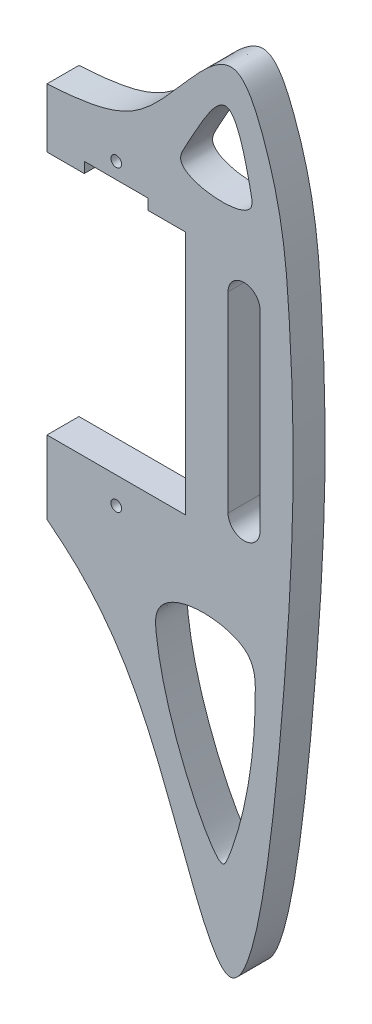
ISO-10303-21;
HEADER;
FILE_DESCRIPTION(('STEP AP214'),'2;1');
FILE_NAME('part.step','',(''),(''),'','','');
FILE_SCHEMA(('AUTOMOTIVE_DESIGN { 1 0 10303 214 1 1 1 1 }'));
ENDSEC;
DATA;
#1=APPLICATION_CONTEXT('core data for automotive mechanical design processes');
#2=APPLICATION_PROTOCOL_DEFINITION('international standard','automotive_design',2000,#1);
#3=PRODUCT_CONTEXT('',#1,'mechanical');
#4=PRODUCT('Part','Part','',(#3));
#5=PRODUCT_RELATED_PRODUCT_CATEGORY('part','',(#4));
#6=PRODUCT_DEFINITION_FORMATION('','',#4);
#7=PRODUCT_DEFINITION_CONTEXT('part definition',#1,'design');
#8=PRODUCT_DEFINITION('design','',#6,#7);
#9=PRODUCT_DEFINITION_SHAPE('','',#8);
#10=(LENGTH_UNIT() NAMED_UNIT(*) SI_UNIT(.MILLI.,.METRE.));
#11=(NAMED_UNIT(*) PLANE_ANGLE_UNIT() SI_UNIT($,.RADIAN.));
#12=(NAMED_UNIT(*) SI_UNIT($,.STERADIAN.) SOLID_ANGLE_UNIT());
#13=UNCERTAINTY_MEASURE_WITH_UNIT(LENGTH_MEASURE(1.E-05),#10,'distance_accuracy_value','');
#14=(GEOMETRIC_REPRESENTATION_CONTEXT(3) GLOBAL_UNCERTAINTY_ASSIGNED_CONTEXT((#13)) GLOBAL_UNIT_ASSIGNED_CONTEXT((#10,
#11,#12)) REPRESENTATION_CONTEXT('',''));
#15=CARTESIAN_POINT('',(0.,0.,0.));
#16=DIRECTION('',(0.,0.,1.));
#17=DIRECTION('',(1.,0.,0.));
#18=AXIS2_PLACEMENT_3D('',#15,#16,#17);
#19=CARTESIAN_POINT('',(-6.5,24.5905263107567,3.));
#20=DIRECTION('',(0.,-1.,0.));
#21=DIRECTION('',(0.,0.,-1.));
#22=AXIS2_PLACEMENT_3D('',#19,#20,#21);
#23=PLANE('',#22);
#24=DIRECTION('',(0.,0.,-1.));
#25=VECTOR('',#24,1.);
#26=CARTESIAN_POINT('',(3.00000000000001,24.5905263107567,-0.0015000000000002));
#27=LINE('',#26,#25);
#28=CARTESIAN_POINT('',(3.00000000000001,24.5905263107567,3.));
#29=VERTEX_POINT('',#28);
#30=CARTESIAN_POINT('',(3.00000000000001,24.5905263107567,0.));
#31=VERTEX_POINT('',#30);
#32=EDGE_CURVE('E239',#29,#31,#27,.T.);
#33=ORIENTED_EDGE('',*,*,#32,.T.);
#34=DIRECTION('',(-1.,0.,0.));
#35=VECTOR('',#34,1.);
#36=CARTESIAN_POINT('',(-6.5,24.5905263107567,0.));
#37=LINE('',#36,#35);
#38=CARTESIAN_POINT('',(6.5,24.5905263107567,0.));
#39=VERTEX_POINT('',#38);
#40=EDGE_CURVE('E242',#39,#31,#37,.T.);
#41=ORIENTED_EDGE('',*,*,#40,.F.);
#42=DIRECTION('',(0.,0.,-1.));
#43=VECTOR('',#42,1.);
#44=CARTESIAN_POINT('',(6.5,24.5905263107567,3.));
#45=LINE('',#44,#43);
#46=CARTESIAN_POINT('',(6.5,24.5905263107567,3.));
#47=VERTEX_POINT('',#46);
#48=EDGE_CURVE('E271',#47,#39,#45,.T.);
#49=ORIENTED_EDGE('',*,*,#48,.F.);
#50=DIRECTION('',(-1.,0.,0.));
#51=VECTOR('',#50,1.);
#52=CARTESIAN_POINT('',(-6.5,24.5905263107567,3.));
#53=LINE('',#52,#51);
#54=EDGE_CURVE('E245',#47,#29,#53,.T.);
#55=ORIENTED_EDGE('',*,*,#54,.T.);
#56=EDGE_LOOP('',(#33,#41,#49,#55));
#57=FACE_BOUND('',#56,.T.);
#58=ADVANCED_FACE('F33',(#57),#23,.T.);
#59=CARTESIAN_POINT('',(16.144596176441,-2.45539061688267,3.));
#60=DIRECTION('',(0.,0.,-1.));
#61=DIRECTION('',(-1.,0.,0.));
#62=AXIS2_PLACEMENT_3D('',#59,#60,#61);
#63=PLANE('',#62);
#64=CARTESIAN_POINT('',(10.372881689873,36.6963033627782,3.));
#65=CARTESIAN_POINT('',(9.31519500281639,36.9421991387234,3.));
#66=CARTESIAN_POINT('',(7.64063538034041,33.5239718010335,3.));
#67=CARTESIAN_POINT('',(4.87372732580464,28.7722586727291,3.));
#68=CARTESIAN_POINT('',(13.220521781435,28.0731721959154,3.));
#69=CARTESIAN_POINT('',(12.2719699943296,32.6964527488286,3.));
#70=CARTESIAN_POINT('',(11.393815380506,36.4589520893633,3.));
#71=CARTESIAN_POINT('',(10.372881689873,36.6963033627782,3.));
#72=B_SPLINE_CURVE_WITH_KNOTS('',3,(#64,#65,#66,#67,#68,#69,#70,#71),.UNSPECIFIED.,.T.,.F.,(4,1,
1,1,1,4),(0.,0.311317763255228,0.3779288802976,0.634090915965268,0.699500053381354,1.),.UNSPECIFIED.);
#73=CARTESIAN_POINT('',(10.372881689873,36.6963033627782,3.));
#74=VERTEX_POINT('',#73);
#75=EDGE_CURVE('E391',#74,#74,#72,.T.);
#76=ORIENTED_EDGE('',*,*,#75,.F.);
#77=EDGE_LOOP('',(#76));
#78=FACE_BOUND('',#77,.T.);
#79=DIRECTION('',(0.,-1.,0.));
#80=VECTOR('',#79,1.);
#81=CARTESIAN_POINT('',(10.5,21.7388183196672,3.));
#82=LINE('',#81,#80);
#83=CARTESIAN_POINT('',(10.5,21.7388183196672,3.));
#84=VERTEX_POINT('',#83);
#85=CARTESIAN_POINT('',(10.5,3.73881831966721,3.));
#86=VERTEX_POINT('',#85);
#87=EDGE_CURVE('E149',#84,#86,#82,.T.);
#88=ORIENTED_EDGE('',*,*,#87,.F.);
#89=CARTESIAN_POINT('',(12.,21.7388183196672,3.));
#90=DIRECTION('',(0.,0.,1.));
#91=DIRECTION('',(1.,0.,0.));
#92=AXIS2_PLACEMENT_3D('',#89,#90,#91);
#93=CIRCLE('',#92,1.5);
#94=CARTESIAN_POINT('',(13.5,21.7388183196672,3.));
#95=VERTEX_POINT('',#94);
#96=EDGE_CURVE('E52',#95,#84,#93,.T.);
#97=ORIENTED_EDGE('',*,*,#96,.F.);
#98=DIRECTION('',(0.,1.,0.));
#99=VECTOR('',#98,1.);
#100=CARTESIAN_POINT('',(13.5,21.7388183196672,3.));
#101=LINE('',#100,#99);
#102=CARTESIAN_POINT('',(13.5,3.73881831966721,3.));
#103=VERTEX_POINT('',#102);
#104=EDGE_CURVE('E156',#103,#95,#101,.T.);
#105=ORIENTED_EDGE('',*,*,#104,.F.);
#106=CARTESIAN_POINT('',(12.,3.73881831966721,3.));
#107=DIRECTION('',(0.,0.,1.));
#108=DIRECTION('',(1.,0.,0.));
#109=AXIS2_PLACEMENT_3D('',#106,#107,#108);
#110=CIRCLE('',#109,1.5);
#111=EDGE_CURVE('E140',#86,#103,#110,.T.);
#112=ORIENTED_EDGE('',*,*,#111,.F.);
#113=EDGE_LOOP('',(#88,#97,#105,#112));
#114=FACE_BOUND('',#113,.T.);
#115=CARTESIAN_POINT('',(3.75939201970323,-9.44477658338475,3.));
#116=CARTESIAN_POINT('',(4.5143742534027,-15.9853062921365,3.));
#117=CARTESIAN_POINT('',(9.52604753642275,-26.30576708168,3.));
#118=CARTESIAN_POINT('',(11.195467527746,-23.0361375709076,3.));
#119=CARTESIAN_POINT('',(13.3026625781607,-15.6736671639301,3.));
#120=CARTESIAN_POINT('',(12.946866156277,-5.00418386460491,3.));
#121=CARTESIAN_POINT('',(3.36787177148466,-4.98847274418026,3.));
#122=CARTESIAN_POINT('',(3.70734931269873,-8.99392243597139,3.));
#123=CARTESIAN_POINT('',(3.75939201970323,-9.44477658338475,3.));
#124=B_SPLINE_CURVE_WITH_KNOTS('',3,(#115,#116,#117,#118,#119,#120,#121,#122,#123),
.UNSPECIFIED.,.T.,.F.,(4,1,1,1,1,1,4),(0.,0.250915666234115,0.333619457240329,0.772213637526381,
0.844334119055923,0.982703791006214,1.),.UNSPECIFIED.);
#125=CARTESIAN_POINT('',(3.75939201970323,-9.44477658338475,3.));
#126=VERTEX_POINT('',#125);
#127=EDGE_CURVE('E163',#126,#126,#124,.T.);
#128=ORIENTED_EDGE('',*,*,#127,.F.);
#129=EDGE_LOOP('',(#128));
#130=FACE_BOUND('',#129,.T.);
#131=CARTESIAN_POINT('',(0.,-0.909473689243284,3.));
#132=DIRECTION('',(0.,0.,1.));
#133=DIRECTION('',(1.,0.,0.));
#134=AXIS2_PLACEMENT_3D('',#131,#132,#133);
#135=CIRCLE('',#134,0.5);
#136=CARTESIAN_POINT('',(0.500000000000004,-0.909473689243284,3.));
#137=VERTEX_POINT('',#136);
#138=EDGE_CURVE('E324',#137,#137,#135,.T.);
#139=ORIENTED_EDGE('',*,*,#138,.F.);
#140=EDGE_LOOP('',(#139));
#141=FACE_BOUND('',#140,.T.);
#142=CARTESIAN_POINT('',(0.,27.0905263107567,3.));
#143=DIRECTION('',(0.,0.,1.));
#144=DIRECTION('',(1.,0.,0.));
#145=AXIS2_PLACEMENT_3D('',#142,#143,#144);
#146=CIRCLE('',#145,0.5);
#147=CARTESIAN_POINT('',(0.500000000000001,27.0905263107567,3.));
#148=VERTEX_POINT('',#147);
#149=EDGE_CURVE('E330',#148,#148,#146,.T.);
#150=ORIENTED_EDGE('',*,*,#149,.F.);
#151=EDGE_LOOP('',(#150));
#152=FACE_BOUND('',#151,.T.);
#153=DIRECTION('',(-1.,0.,0.));
#154=VECTOR('',#153,1.);
#155=CARTESIAN_POINT('',(-2.99999999999999,25.5905263107567,3.));
#156=LINE('',#155,#154);
#157=CARTESIAN_POINT('',(3.00000000000001,25.5905263107567,3.));
#158=VERTEX_POINT('',#157);
#159=CARTESIAN_POINT('',(-2.99999999999999,25.5905263107567,3.));
#160=VERTEX_POINT('',#159);
#161=EDGE_CURVE('E350',#158,#160,#156,.T.);
#162=ORIENTED_EDGE('',*,*,#161,.F.);
#163=DIRECTION('',(0.,1.,0.));
#164=VECTOR('',#163,1.);
#165=CARTESIAN_POINT('',(3.00000000000001,23.5905263107567,3.));
#166=LINE('',#165,#164);
#167=EDGE_CURVE('E347',#29,#158,#166,.T.);
#168=ORIENTED_EDGE('',*,*,#167,.F.);
#169=ORIENTED_EDGE('',*,*,#54,.F.);
#170=DIRECTION('',(0.,1.,0.));
#171=VECTOR('',#170,1.);
#172=CARTESIAN_POINT('',(6.5,24.5905263107567,3.));
#173=LINE('',#172,#171);
#174=CARTESIAN_POINT('',(6.50000000000001,1.59052631075672,3.));
#175=VERTEX_POINT('',#174);
#176=EDGE_CURVE('E261',#175,#47,#173,.T.);
#177=ORIENTED_EDGE('',*,*,#176,.F.);
#178=DIRECTION('',(1.,0.,0.));
#179=VECTOR('',#178,1.);
#180=CARTESIAN_POINT('',(3.,1.59052631075671,3.));
#181=LINE('',#180,#179);
#182=CARTESIAN_POINT('',(-6.49999999999999,1.59052631075672,3.));
#183=VERTEX_POINT('',#182);
#184=EDGE_CURVE('E258',#183,#175,#181,.T.);
#185=ORIENTED_EDGE('',*,*,#184,.F.);
#186=DIRECTION('',(0.,-1.,0.));
#187=VECTOR('',#186,1.);
#188=CARTESIAN_POINT('',(-6.5,0.,3.));
#189=LINE('',#188,#187);
#190=CARTESIAN_POINT('',(-6.50000001952055,-5.28879809395411,3.));
#191=VERTEX_POINT('',#190);
#192=EDGE_CURVE('E298',#183,#191,#189,.T.);
#193=ORIENTED_EDGE('',*,*,#192,.T.);
#194=CARTESIAN_POINT('',(-11.5,-2.00304372154737,3.));
#195=CARTESIAN_POINT('',(-4.52232865177583,-6.07526479466163,3.));
#196=CARTESIAN_POINT('',(2.80112044993022,-13.0475391723462,3.));
#197=CARTESIAN_POINT('',(11.9215419000808,-45.3547195910934,3.));
#198=CARTESIAN_POINT('',(16.8120306074721,-1.6656134956271,3.));
#199=CARTESIAN_POINT('',(16.8274905865256,16.749830902761,3.));
#200=CARTESIAN_POINT('',(15.4635379131818,32.6125733523875,3.));
#201=CARTESIAN_POINT('',(11.1825757780398,42.0998204916923,3.));
#202=CARTESIAN_POINT('',(1.86481394259771,31.5362558417921,3.));
#203=CARTESIAN_POINT('',(0.931030807737429,30.1439955510952,3.));
#204=CARTESIAN_POINT('',(-11.5,29.9891657737198,3.));
#205=B_SPLINE_CURVE_WITH_KNOTS('',3,(#194,#195,#196,#197,#198,#199,#200,#201,#202,#203,#204),
.UNSPECIFIED.,.F.,.F.,(4,1,1,1,1,1,1,1,4),(0.,0.154651302200441,0.281898123324239,
0.457580473652212,0.69157643814912,0.788616296966982,0.821944108232016,0.862455112642539,1.),.UNSPECIFIED.);
#206=CARTESIAN_POINT('',(-6.49999999999568,30.1410312668798,3.));
#207=VERTEX_POINT('',#206);
#208=EDGE_CURVE('E289',#191,#207,#205,.T.);
#209=ORIENTED_EDGE('',*,*,#208,.T.);
#210=CARTESIAN_POINT('',(-6.5,24.5905263107567,3.));
#211=VERTEX_POINT('',#210);
#212=EDGE_CURVE('E293',#207,#211,#189,.T.);
#213=ORIENTED_EDGE('',*,*,#212,.T.);
#214=CARTESIAN_POINT('',(-2.99999999999999,24.5905263107567,3.));
#215=VERTEX_POINT('',#214);
#216=EDGE_CURVE('E337',#215,#211,#53,.T.);
#217=ORIENTED_EDGE('',*,*,#216,.F.);
#218=DIRECTION('',(0.,-1.,0.));
#219=VECTOR('',#218,1.);
#220=CARTESIAN_POINT('',(-2.99999999999999,23.5905263107567,3.));
#221=LINE('',#220,#219);
#222=EDGE_CURVE('E352',#160,#215,#221,.T.);
#223=ORIENTED_EDGE('',*,*,#222,.F.);
#224=EDGE_LOOP('',(#162,#168,#169,#177,#185,#193,#209,#213,#217,#223));
#225=FACE_BOUND('',#224,.T.);
#226=ADVANCED_FACE('F153',(#78,#114,#130,#141,#152,#225),#63,.F.);
#227=CARTESIAN_POINT('',(16.144596176441,-2.45539061688267,0.));
#228=DIRECTION('',(0.,0.,-1.));
#229=DIRECTION('',(-1.,0.,0.));
#230=AXIS2_PLACEMENT_3D('',#227,#228,#229);
#231=PLANE('',#230);
#232=CARTESIAN_POINT('',(10.372881689873,36.6963033627782,0.));
#233=CARTESIAN_POINT('',(9.31519500281639,36.9421991387234,0.));
#234=CARTESIAN_POINT('',(7.64063538034041,33.5239718010335,0.));
#235=CARTESIAN_POINT('',(4.87372732580464,28.7722586727291,0.));
#236=CARTESIAN_POINT('',(13.220521781435,28.0731721959154,0.));
#237=CARTESIAN_POINT('',(12.2719699943296,32.6964527488286,0.));
#238=CARTESIAN_POINT('',(11.393815380506,36.4589520893633,0.));
#239=CARTESIAN_POINT('',(10.372881689873,36.6963033627782,0.));
#240=B_SPLINE_CURVE_WITH_KNOTS('',3,(#232,#233,#234,#235,#236,#237,#238,#239),.UNSPECIFIED.,.T.,
.F.,(4,1,1,1,1,4),(0.,0.311317763255228,0.3779288802976,0.634090915965268,0.699500053381354,1.),.UNSPECIFIED.);
#241=CARTESIAN_POINT('',(10.372881689873,36.6963033627782,0.));
#242=VERTEX_POINT('',#241);
#243=EDGE_CURVE('E38',#242,#242,#240,.F.);
#244=ORIENTED_EDGE('',*,*,#243,.F.);
#245=EDGE_LOOP('',(#244));
#246=FACE_BOUND('',#245,.T.);
#247=CARTESIAN_POINT('',(12.,21.7388183196672,0.));
#248=DIRECTION('',(0.,0.,-1.));
#249=DIRECTION('',(-1.,0.,0.));
#250=AXIS2_PLACEMENT_3D('',#247,#248,#249);
#251=CIRCLE('',#250,1.5);
#252=CARTESIAN_POINT('',(10.5,21.7388183196672,0.));
#253=VERTEX_POINT('',#252);
#254=CARTESIAN_POINT('',(13.5,21.7388183196672,0.));
#255=VERTEX_POINT('',#254);
#256=EDGE_CURVE('E11',#253,#255,#251,.T.);
#257=ORIENTED_EDGE('',*,*,#256,.F.);
#258=DIRECTION('',(0.,1.,0.));
#259=VECTOR('',#258,1.);
#260=CARTESIAN_POINT('',(10.5,-2.45539061688267,0.));
#261=LINE('',#260,#259);
#262=CARTESIAN_POINT('',(10.5,3.73881831966721,0.));
#263=VERTEX_POINT('',#262);
#264=EDGE_CURVE('E292',#263,#253,#261,.T.);
#265=ORIENTED_EDGE('',*,*,#264,.F.);
#266=CARTESIAN_POINT('',(12.,3.73881831966721,0.));
#267=DIRECTION('',(0.,0.,-1.));
#268=DIRECTION('',(-1.,0.,0.));
#269=AXIS2_PLACEMENT_3D('',#266,#267,#268);
#270=CIRCLE('',#269,1.5);
#271=CARTESIAN_POINT('',(13.5,3.73881831966721,0.));
#272=VERTEX_POINT('',#271);
#273=EDGE_CURVE('E143',#272,#263,#270,.T.);
#274=ORIENTED_EDGE('',*,*,#273,.F.);
#275=DIRECTION('',(0.,-1.,0.));
#276=VECTOR('',#275,1.);
#277=CARTESIAN_POINT('',(13.5,-2.45539061688267,0.));
#278=LINE('',#277,#276);
#279=EDGE_CURVE('E45',#255,#272,#278,.T.);
#280=ORIENTED_EDGE('',*,*,#279,.F.);
#281=EDGE_LOOP('',(#257,#265,#274,#280));
#282=FACE_BOUND('',#281,.T.);
#283=CARTESIAN_POINT('',(3.75939201970323,-9.44477658338475,0.));
#284=CARTESIAN_POINT('',(4.5143742534027,-15.9853062921365,0.));
#285=CARTESIAN_POINT('',(9.52604753642275,-26.30576708168,0.));
#286=CARTESIAN_POINT('',(11.195467527746,-23.0361375709076,0.));
#287=CARTESIAN_POINT('',(13.3026625781607,-15.6736671639301,0.));
#288=CARTESIAN_POINT('',(12.946866156277,-5.00418386460491,0.));
#289=CARTESIAN_POINT('',(3.36787177148466,-4.98847274418026,0.));
#290=CARTESIAN_POINT('',(3.70734931269873,-8.99392243597139,0.));
#291=CARTESIAN_POINT('',(3.75939201970323,-9.44477658338475,0.));
#292=B_SPLINE_CURVE_WITH_KNOTS('',3,(#283,#284,#285,#286,#287,#288,#289,#290,#291),
.UNSPECIFIED.,.T.,.F.,(4,1,1,1,1,1,4),(0.,0.250915666234115,0.333619457240329,0.772213637526381,
0.844334119055923,0.982703791006214,1.),.UNSPECIFIED.);
#293=CARTESIAN_POINT('',(3.75939201970323,-9.44477658338475,0.));
#294=VERTEX_POINT('',#293);
#295=EDGE_CURVE('E372',#294,#294,#292,.F.);
#296=ORIENTED_EDGE('',*,*,#295,.F.);
#297=EDGE_LOOP('',(#296));
#298=FACE_BOUND('',#297,.T.);
#299=DIRECTION('',(0.,1.,0.));
#300=VECTOR('',#299,1.);
#301=CARTESIAN_POINT('',(3.00000000000001,23.5905263107567,0.));
#302=LINE('',#301,#300);
#303=CARTESIAN_POINT('',(3.00000000000001,25.5905263107567,0.));
#304=VERTEX_POINT('',#303);
#305=EDGE_CURVE('E255',#31,#304,#302,.T.);
#306=ORIENTED_EDGE('',*,*,#305,.T.);
#307=DIRECTION('',(-1.,0.,0.));
#308=VECTOR('',#307,1.);
#309=CARTESIAN_POINT('',(-2.99999999999999,25.5905263107567,0.));
#310=LINE('',#309,#308);
#311=CARTESIAN_POINT('',(-2.99999999999999,25.5905263107567,0.));
#312=VERTEX_POINT('',#311);
#313=EDGE_CURVE('E303',#304,#312,#310,.T.);
#314=ORIENTED_EDGE('',*,*,#313,.T.);
#315=DIRECTION('',(0.,-1.,0.));
#316=VECTOR('',#315,1.);
#317=CARTESIAN_POINT('',(-2.99999999999999,23.5905263107567,0.));
#318=LINE('',#317,#316);
#319=CARTESIAN_POINT('',(-2.99999999999999,24.5905263107567,0.));
#320=VERTEX_POINT('',#319);
#321=EDGE_CURVE('E248',#312,#320,#318,.T.);
#322=ORIENTED_EDGE('',*,*,#321,.T.);
#323=CARTESIAN_POINT('',(-6.5,24.5905263107567,0.));
#324=VERTEX_POINT('',#323);
#325=EDGE_CURVE('E259',#320,#324,#37,.T.);
#326=ORIENTED_EDGE('',*,*,#325,.T.);
#327=DIRECTION('',(0.,1.,0.));
#328=VECTOR('',#327,1.);
#329=CARTESIAN_POINT('',(-6.5,-2.45539061688267,0.));
#330=LINE('',#329,#328);
#331=CARTESIAN_POINT('',(-6.49999999999568,30.1410312668798,0.));
#332=VERTEX_POINT('',#331);
#333=EDGE_CURVE('E312',#324,#332,#330,.T.);
#334=ORIENTED_EDGE('',*,*,#333,.T.);
#335=CARTESIAN_POINT('',(-11.5,-2.00304372154737,0.));
#336=CARTESIAN_POINT('',(-4.52232865177583,-6.07526479466163,0.));
#337=CARTESIAN_POINT('',(2.80112044993022,-13.0475391723462,0.));
#338=CARTESIAN_POINT('',(11.9215419000808,-45.3547195910934,0.));
#339=CARTESIAN_POINT('',(16.8120306074721,-1.6656134956271,0.));
#340=CARTESIAN_POINT('',(16.8274905865256,16.749830902761,0.));
#341=CARTESIAN_POINT('',(15.4635379131818,32.6125733523875,0.));
#342=CARTESIAN_POINT('',(11.1825757780398,42.0998204916923,0.));
#343=CARTESIAN_POINT('',(1.86481394259771,31.5362558417921,0.));
#344=CARTESIAN_POINT('',(0.931030807737429,30.1439955510952,0.));
#345=CARTESIAN_POINT('',(-11.5,29.9891657737198,0.));
#346=B_SPLINE_CURVE_WITH_KNOTS('',3,(#335,#336,#337,#338,#339,#340,#341,#342,#343,#344,#345),
.UNSPECIFIED.,.F.,.F.,(4,1,1,1,1,1,1,1,4),(0.,0.154651302200441,0.281898123324239,
0.457580473652212,0.69157643814912,0.788616296966982,0.821944108232016,0.862455112642539,1.),.UNSPECIFIED.);
#347=CARTESIAN_POINT('',(-6.50000001952055,-5.28879809395411,0.));
#348=VERTEX_POINT('',#347);
#349=EDGE_CURVE('E275',#348,#332,#346,.T.);
#350=ORIENTED_EDGE('',*,*,#349,.F.);
#351=CARTESIAN_POINT('',(-6.5,1.59052631075671,0.));
#352=VERTEX_POINT('',#351);
#353=EDGE_CURVE('E317',#348,#352,#330,.T.);
#354=ORIENTED_EDGE('',*,*,#353,.T.);
#355=DIRECTION('',(1.,0.,0.));
#356=VECTOR('',#355,1.);
#357=CARTESIAN_POINT('',(3.,1.59052631075671,0.));
#358=LINE('',#357,#356);
#359=CARTESIAN_POINT('',(6.50000000000001,1.59052631075672,0.));
#360=VERTEX_POINT('',#359);
#361=EDGE_CURVE('E333',#352,#360,#358,.T.);
#362=ORIENTED_EDGE('',*,*,#361,.T.);
#363=DIRECTION('',(0.,1.,0.));
#364=VECTOR('',#363,1.);
#365=CARTESIAN_POINT('',(6.5,24.5905263107567,0.));
#366=LINE('',#365,#364);
#367=EDGE_CURVE('E257',#360,#39,#366,.T.);
#368=ORIENTED_EDGE('',*,*,#367,.T.);
#369=ORIENTED_EDGE('',*,*,#40,.T.);
#370=EDGE_LOOP('',(#306,#314,#322,#326,#334,#350,#354,#362,#368,#369));
#371=FACE_BOUND('',#370,.T.);
#372=CARTESIAN_POINT('',(0.,27.0905263107567,0.));
#373=DIRECTION('',(0.,0.,1.));
#374=DIRECTION('',(1.,0.,0.));
#375=AXIS2_PLACEMENT_3D('',#372,#373,#374);
#376=CIRCLE('',#375,0.5);
#377=CARTESIAN_POINT('',(0.500000000000001,27.0905263107567,0.));
#378=VERTEX_POINT('',#377);
#379=EDGE_CURVE('E327',#378,#378,#376,.T.);
#380=ORIENTED_EDGE('',*,*,#379,.T.);
#381=EDGE_LOOP('',(#380));
#382=FACE_BOUND('',#381,.T.);
#383=CARTESIAN_POINT('',(0.,-0.909473689243284,0.));
#384=DIRECTION('',(0.,0.,1.));
#385=DIRECTION('',(1.,0.,0.));
#386=AXIS2_PLACEMENT_3D('',#383,#384,#385);
#387=CIRCLE('',#386,0.5);
#388=CARTESIAN_POINT('',(0.500000000000004,-0.909473689243284,0.));
#389=VERTEX_POINT('',#388);
#390=EDGE_CURVE('E323',#389,#389,#387,.T.);
#391=ORIENTED_EDGE('',*,*,#390,.T.);
#392=EDGE_LOOP('',(#391));
#393=FACE_BOUND('',#392,.T.);
#394=ADVANCED_FACE('F222',(#246,#282,#298,#371,#382,#393),#231,.T.);
#395=DIRECTION('',(0.,0.,-1.));
#396=VECTOR('',#395,1.);
#397=SURFACE_OF_LINEAR_EXTRUSION('',#205,#396);
#398=DIRECTION('',(0.,0.,1.));
#399=VECTOR('',#398,1.);
#400=CARTESIAN_POINT('',(-6.50000001952055,-5.28879809395411,-2.));
#401=LINE('',#400,#399);
#402=EDGE_CURVE('E310',#348,#191,#401,.T.);
#403=ORIENTED_EDGE('',*,*,#402,.F.);
#404=ORIENTED_EDGE('',*,*,#349,.T.);
#405=DIRECTION('',(0.,0.,1.));
#406=VECTOR('',#405,1.);
#407=CARTESIAN_POINT('',(-6.49999999999568,30.1410312668798,-2.));
#408=LINE('',#407,#406);
#409=EDGE_CURVE('E297',#332,#207,#408,.T.);
#410=ORIENTED_EDGE('',*,*,#409,.T.);
#411=ORIENTED_EDGE('',*,*,#208,.F.);
#412=EDGE_LOOP('',(#403,#404,#410,#411));
#413=FACE_BOUND('',#412,.T.);
#414=ADVANCED_FACE('F35',(#413),#397,.F.);
#415=CARTESIAN_POINT('',(3.,1.59052631075671,3.));
#416=DIRECTION('',(0.,1.,0.));
#417=DIRECTION('',(-1.,0.,0.));
#418=AXIS2_PLACEMENT_3D('',#415,#416,#417);
#419=PLANE('',#418);
#420=ORIENTED_EDGE('',*,*,#361,.F.);
#421=DIRECTION('',(0.,0.,-1.));
#422=VECTOR('',#421,1.);
#423=CARTESIAN_POINT('',(-6.49999999999999,1.59052631075672,3.));
#424=LINE('',#423,#422);
#425=EDGE_CURVE('E266',#183,#352,#424,.T.);
#426=ORIENTED_EDGE('',*,*,#425,.F.);
#427=ORIENTED_EDGE('',*,*,#184,.T.);
#428=DIRECTION('',(0.,0.,-1.));
#429=VECTOR('',#428,1.);
#430=CARTESIAN_POINT('',(6.50000000000001,1.59052631075672,3.));
#431=LINE('',#430,#429);
#432=EDGE_CURVE('E273',#175,#360,#431,.T.);
#433=ORIENTED_EDGE('',*,*,#432,.T.);
#434=EDGE_LOOP('',(#420,#426,#427,#433));
#435=FACE_BOUND('',#434,.T.);
#436=ADVANCED_FACE('F216',(#435),#419,.T.);
#437=CARTESIAN_POINT('',(6.5,24.5905263107567,3.));
#438=DIRECTION('',(-1.,0.,0.));
#439=DIRECTION('',(0.,-1.,0.));
#440=AXIS2_PLACEMENT_3D('',#437,#438,#439);
#441=PLANE('',#440);
#442=ORIENTED_EDGE('',*,*,#367,.F.);
#443=ORIENTED_EDGE('',*,*,#432,.F.);
#444=ORIENTED_EDGE('',*,*,#176,.T.);
#445=ORIENTED_EDGE('',*,*,#48,.T.);
#446=EDGE_LOOP('',(#442,#443,#444,#445));
#447=FACE_BOUND('',#446,.T.);
#448=ADVANCED_FACE('F212',(#447),#441,.T.);
#449=DIRECTION('',(0.,0.,1.));
#450=VECTOR('',#449,1.);
#451=CARTESIAN_POINT('',(-2.99999999999999,24.5905263107567,-0.0015000000000002));
#452=LINE('',#451,#450);
#453=EDGE_CURVE('E249',#320,#215,#452,.T.);
#454=ORIENTED_EDGE('',*,*,#453,.T.);
#455=ORIENTED_EDGE('',*,*,#216,.T.);
#456=DIRECTION('',(0.,0.,-1.));
#457=VECTOR('',#456,1.);
#458=CARTESIAN_POINT('',(-6.5,24.5905263107567,3.));
#459=LINE('',#458,#457);
#460=EDGE_CURVE('E268',#211,#324,#459,.T.);
#461=ORIENTED_EDGE('',*,*,#460,.T.);
#462=ORIENTED_EDGE('',*,*,#325,.F.);
#463=EDGE_LOOP('',(#454,#455,#461,#462));
#464=FACE_BOUND('',#463,.T.);
#465=ADVANCED_FACE('F208',(#464),#23,.T.);
#466=CARTESIAN_POINT('',(0.,27.0905263107567,3.));
#467=DIRECTION('',(0.,0.,-1.));
#468=DIRECTION('',(-1.,0.,0.));
#469=AXIS2_PLACEMENT_3D('',#466,#467,#468);
#470=CYLINDRICAL_SURFACE('',#469,0.5);
#471=ORIENTED_EDGE('',*,*,#149,.T.);
#472=EDGE_LOOP('',(#471));
#473=FACE_BOUND('',#472,.T.);
#474=ORIENTED_EDGE('',*,*,#379,.F.);
#475=EDGE_LOOP('',(#474));
#476=FACE_BOUND('',#475,.T.);
#477=ADVANCED_FACE('F204',(#473,#476),#470,.F.);
#478=CARTESIAN_POINT('',(0.,-0.909473689243284,3.));
#479=DIRECTION('',(0.,0.,-1.));
#480=DIRECTION('',(-1.,0.,0.));
#481=AXIS2_PLACEMENT_3D('',#478,#479,#480);
#482=CYLINDRICAL_SURFACE('',#481,0.5);
#483=ORIENTED_EDGE('',*,*,#138,.T.);
#484=EDGE_LOOP('',(#483));
#485=FACE_BOUND('',#484,.T.);
#486=ORIENTED_EDGE('',*,*,#390,.F.);
#487=EDGE_LOOP('',(#486));
#488=FACE_BOUND('',#487,.T.);
#489=ADVANCED_FACE('F200',(#485,#488),#482,.F.);
#490=CARTESIAN_POINT('',(-6.5,0.,-2.));
#491=DIRECTION('',(-1.,0.,0.));
#492=DIRECTION('',(0.,-1.,0.));
#493=AXIS2_PLACEMENT_3D('',#490,#491,#492);
#494=PLANE('',#493);
#495=ORIENTED_EDGE('',*,*,#460,.F.);
#496=ORIENTED_EDGE('',*,*,#212,.F.);
#497=ORIENTED_EDGE('',*,*,#409,.F.);
#498=ORIENTED_EDGE('',*,*,#333,.F.);
#499=EDGE_LOOP('',(#495,#496,#497,#498));
#500=FACE_BOUND('',#499,.T.);
#501=ADVANCED_FACE('F197',(#500),#494,.T.);
#502=ORIENTED_EDGE('',*,*,#402,.T.);
#503=ORIENTED_EDGE('',*,*,#192,.F.);
#504=ORIENTED_EDGE('',*,*,#425,.T.);
#505=ORIENTED_EDGE('',*,*,#353,.F.);
#506=EDGE_LOOP('',(#502,#503,#504,#505));
#507=FACE_BOUND('',#506,.T.);
#508=ADVANCED_FACE('F195',(#507),#494,.T.);
#509=CARTESIAN_POINT('',(3.00000000000001,23.5905263107567,-0.0015000000000002));
#510=DIRECTION('',(1.,0.,0.));
#511=DIRECTION('',(0.,0.,-1.));
#512=AXIS2_PLACEMENT_3D('',#509,#510,#511);
#513=PLANE('',#512);
#514=ORIENTED_EDGE('',*,*,#32,.F.);
#515=ORIENTED_EDGE('',*,*,#167,.T.);
#516=DIRECTION('',(0.,0.,1.));
#517=VECTOR('',#516,1.);
#518=CARTESIAN_POINT('',(3.00000000000001,25.5905263107567,-0.0015000000000002));
#519=LINE('',#518,#517);
#520=EDGE_CURVE('E358',#304,#158,#519,.T.);
#521=ORIENTED_EDGE('',*,*,#520,.F.);
#522=ORIENTED_EDGE('',*,*,#305,.F.);
#523=EDGE_LOOP('',(#514,#515,#521,#522));
#524=FACE_BOUND('',#523,.T.);
#525=ADVANCED_FACE('F188',(#524),#513,.F.);
#526=CARTESIAN_POINT('',(-2.99999999999999,23.5905263107567,-0.0015000000000002));
#527=DIRECTION('',(-1.,0.,0.));
#528=DIRECTION('',(0.,0.,1.));
#529=AXIS2_PLACEMENT_3D('',#526,#527,#528);
#530=PLANE('',#529);
#531=DIRECTION('',(0.,0.,1.));
#532=VECTOR('',#531,1.);
#533=CARTESIAN_POINT('',(-2.99999999999999,25.5905263107567,-0.0015000000000002));
#534=LINE('',#533,#532);
#535=EDGE_CURVE('E359',#312,#160,#534,.T.);
#536=ORIENTED_EDGE('',*,*,#535,.T.);
#537=ORIENTED_EDGE('',*,*,#222,.T.);
#538=ORIENTED_EDGE('',*,*,#453,.F.);
#539=ORIENTED_EDGE('',*,*,#321,.F.);
#540=EDGE_LOOP('',(#536,#537,#538,#539));
#541=FACE_BOUND('',#540,.T.);
#542=ADVANCED_FACE('F185',(#541),#530,.F.);
#543=CARTESIAN_POINT('',(-2.99999999999999,25.5905263107567,-0.0015000000000002));
#544=DIRECTION('',(0.,1.,0.));
#545=DIRECTION('',(0.,0.,1.));
#546=AXIS2_PLACEMENT_3D('',#543,#544,#545);
#547=PLANE('',#546);
#548=ORIENTED_EDGE('',*,*,#520,.T.);
#549=ORIENTED_EDGE('',*,*,#161,.T.);
#550=ORIENTED_EDGE('',*,*,#535,.F.);
#551=ORIENTED_EDGE('',*,*,#313,.F.);
#552=EDGE_LOOP('',(#548,#549,#550,#551));
#553=FACE_BOUND('',#552,.T.);
#554=ADVANCED_FACE('F182',(#553),#547,.F.);
#555=CARTESIAN_POINT('',(3.75939201970323,-9.44477658338475,-2.));
#556=CARTESIAN_POINT('',(4.5143742534027,-15.9853062921365,-2.));
#557=CARTESIAN_POINT('',(9.52604753642275,-26.30576708168,-2.));
#558=CARTESIAN_POINT('',(11.195467527746,-23.0361375709076,-2.));
#559=CARTESIAN_POINT('',(13.3026625781607,-15.6736671639301,-2.));
#560=CARTESIAN_POINT('',(12.946866156277,-5.00418386460491,-2.));
#561=CARTESIAN_POINT('',(3.36787177148466,-4.98847274418026,-2.));
#562=CARTESIAN_POINT('',(3.70734931269873,-8.99392243597139,-2.));
#563=CARTESIAN_POINT('',(3.75939201970323,-9.44477658338475,-2.));
#564=B_SPLINE_CURVE_WITH_KNOTS('',3,(#555,#556,#557,#558,#559,#560,#561,#562,#563),
.UNSPECIFIED.,.T.,.F.,(4,1,1,1,1,1,4),(0.,0.250915666234115,0.333619457240329,0.772213637526381,
0.844334119055923,0.982703791006214,1.),.UNSPECIFIED.);
#565=DIRECTION('',(0.,0.,1.));
#566=VECTOR('',#565,1.);
#567=SURFACE_OF_LINEAR_EXTRUSION('',#564,#566);
#568=ORIENTED_EDGE('',*,*,#295,.T.);
#569=EDGE_LOOP('',(#568));
#570=FACE_BOUND('',#569,.T.);
#571=ORIENTED_EDGE('',*,*,#127,.T.);
#572=EDGE_LOOP('',(#571));
#573=FACE_BOUND('',#572,.T.);
#574=ADVANCED_FACE('F177',(#570,#573),#567,.F.);
#575=CARTESIAN_POINT('',(12.,21.7388183196672,-2.));
#576=DIRECTION('',(0.,0.,1.));
#577=DIRECTION('',(1.,0.,0.));
#578=AXIS2_PLACEMENT_3D('',#575,#576,#577);
#579=CYLINDRICAL_SURFACE('',#578,1.5);
#580=ORIENTED_EDGE('',*,*,#256,.T.);
#581=DIRECTION('',(0.,0.,1.));
#582=VECTOR('',#581,1.);
#583=CARTESIAN_POINT('',(13.5,21.7388183196672,-2.));
#584=LINE('',#583,#582);
#585=EDGE_CURVE('E161',#255,#95,#584,.T.);
#586=ORIENTED_EDGE('',*,*,#585,.T.);
#587=ORIENTED_EDGE('',*,*,#96,.T.);
#588=DIRECTION('',(0.,0.,1.));
#589=VECTOR('',#588,1.);
#590=CARTESIAN_POINT('',(10.5,21.7388183196672,-2.));
#591=LINE('',#590,#589);
#592=EDGE_CURVE('E146',#253,#84,#591,.T.);
#593=ORIENTED_EDGE('',*,*,#592,.F.);
#594=EDGE_LOOP('',(#580,#586,#587,#593));
#595=FACE_BOUND('',#594,.T.);
#596=ADVANCED_FACE('F181',(#595),#579,.F.);
#597=CARTESIAN_POINT('',(13.5,21.7388183196672,-2.));
#598=DIRECTION('',(1.,0.,0.));
#599=DIRECTION('',(0.,1.,0.));
#600=AXIS2_PLACEMENT_3D('',#597,#598,#599);
#601=PLANE('',#600);
#602=ORIENTED_EDGE('',*,*,#279,.T.);
#603=DIRECTION('',(0.,0.,1.));
#604=VECTOR('',#603,1.);
#605=CARTESIAN_POINT('',(13.5,3.73881831966721,-2.));
#606=LINE('',#605,#604);
#607=EDGE_CURVE('E145',#272,#103,#606,.T.);
#608=ORIENTED_EDGE('',*,*,#607,.T.);
#609=ORIENTED_EDGE('',*,*,#104,.T.);
#610=ORIENTED_EDGE('',*,*,#585,.F.);
#611=EDGE_LOOP('',(#602,#608,#609,#610));
#612=FACE_BOUND('',#611,.T.);
#613=ADVANCED_FACE('F387',(#612),#601,.F.);
#614=CARTESIAN_POINT('',(12.,3.73881831966721,-2.));
#615=DIRECTION('',(0.,0.,1.));
#616=DIRECTION('',(1.,0.,0.));
#617=AXIS2_PLACEMENT_3D('',#614,#615,#616);
#618=CYLINDRICAL_SURFACE('',#617,1.5);
#619=ORIENTED_EDGE('',*,*,#273,.T.);
#620=DIRECTION('',(0.,0.,1.));
#621=VECTOR('',#620,1.);
#622=CARTESIAN_POINT('',(10.5,3.73881831966721,-2.));
#623=LINE('',#622,#621);
#624=EDGE_CURVE('E60',#263,#86,#623,.T.);
#625=ORIENTED_EDGE('',*,*,#624,.T.);
#626=ORIENTED_EDGE('',*,*,#111,.T.);
#627=ORIENTED_EDGE('',*,*,#607,.F.);
#628=EDGE_LOOP('',(#619,#625,#626,#627));
#629=FACE_BOUND('',#628,.T.);
#630=ADVANCED_FACE('F137',(#629),#618,.F.);
#631=CARTESIAN_POINT('',(10.5,21.7388183196672,-2.));
#632=DIRECTION('',(-1.,0.,0.));
#633=DIRECTION('',(0.,-1.,0.));
#634=AXIS2_PLACEMENT_3D('',#631,#632,#633);
#635=PLANE('',#634);
#636=ORIENTED_EDGE('',*,*,#264,.T.);
#637=ORIENTED_EDGE('',*,*,#592,.T.);
#638=ORIENTED_EDGE('',*,*,#87,.T.);
#639=ORIENTED_EDGE('',*,*,#624,.F.);
#640=EDGE_LOOP('',(#636,#637,#638,#639));
#641=FACE_BOUND('',#640,.T.);
#642=ADVANCED_FACE('F150',(#641),#635,.F.);
#643=CARTESIAN_POINT('',(10.372881689873,36.6963033627782,-2.));
#644=CARTESIAN_POINT('',(9.31519500281639,36.9421991387234,-2.));
#645=CARTESIAN_POINT('',(7.64063538034041,33.5239718010335,-2.));
#646=CARTESIAN_POINT('',(4.87372732580464,28.7722586727291,-2.));
#647=CARTESIAN_POINT('',(13.220521781435,28.0731721959154,-2.));
#648=CARTESIAN_POINT('',(12.2719699943296,32.6964527488286,-2.));
#649=CARTESIAN_POINT('',(11.393815380506,36.4589520893633,-2.));
#650=CARTESIAN_POINT('',(10.372881689873,36.6963033627782,-2.));
#651=B_SPLINE_CURVE_WITH_KNOTS('',3,(#643,#644,#645,#646,#647,#648,#649,#650),.UNSPECIFIED.,.T.,
.F.,(4,1,1,1,1,4),(0.,0.311317763255228,0.3779288802976,0.634090915965268,0.699500053381354,1.),.UNSPECIFIED.);
#652=DIRECTION('',(0.,0.,1.));
#653=VECTOR('',#652,1.);
#654=SURFACE_OF_LINEAR_EXTRUSION('',#651,#653);
#655=ORIENTED_EDGE('',*,*,#243,.T.);
#656=EDGE_LOOP('',(#655));
#657=FACE_BOUND('',#656,.T.);
#658=ORIENTED_EDGE('',*,*,#75,.T.);
#659=EDGE_LOOP('',(#658));
#660=FACE_BOUND('',#659,.T.);
#661=ADVANCED_FACE('F407',(#657,#660),#654,.F.);
#662=CLOSED_SHELL('',(#58,#226,#394,#414,#436,#448,#465,#477,#489,#501,#508,#525,#542,#554,#574,
#596,#613,#630,#642,#661));
#663=MANIFOLD_SOLID_BREP('B2',#662);
#664=ADVANCED_BREP_SHAPE_REPRESENTATION('',(#18,#663),#14);
#665=SHAPE_DEFINITION_REPRESENTATION(#9,#664);
ENDSEC;
END-ISO-10303-21;
